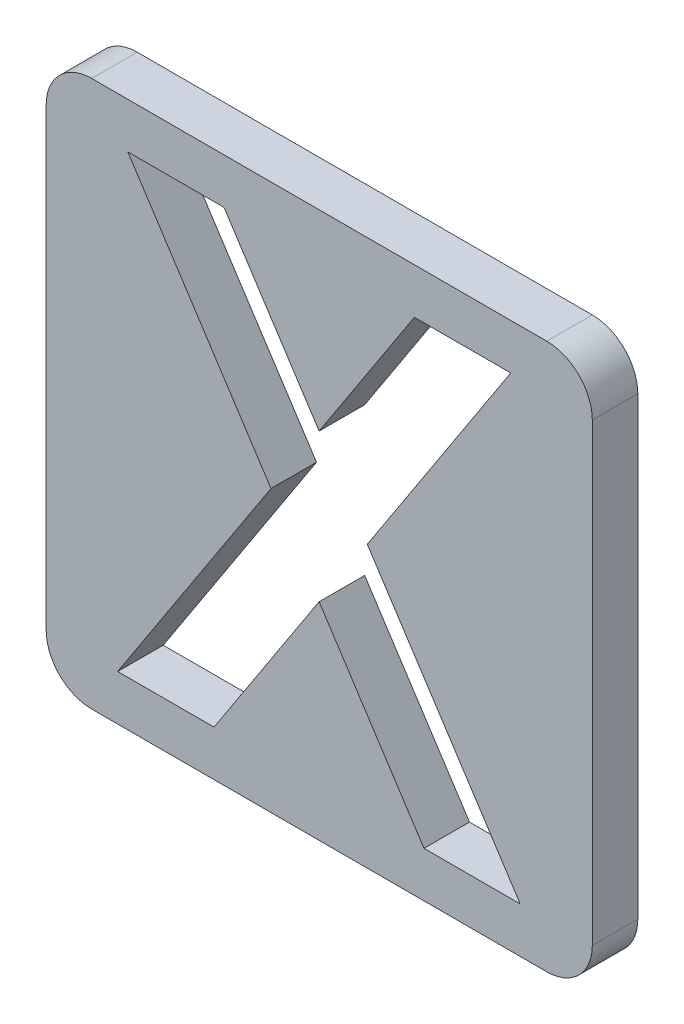
ISO-10303-21;
HEADER;
FILE_DESCRIPTION(('STEP AP214'),'2;1');
FILE_NAME('part.step','',(''),(''),'','','');
FILE_SCHEMA(('AUTOMOTIVE_DESIGN { 1 0 10303 214 1 1 1 1 }'));
ENDSEC;
DATA;
#1=APPLICATION_CONTEXT('core data for automotive mechanical design processes');
#2=APPLICATION_PROTOCOL_DEFINITION('international standard','automotive_design',2000,#1);
#3=PRODUCT_CONTEXT('',#1,'mechanical');
#4=PRODUCT('Part','Part','',(#3));
#5=PRODUCT_RELATED_PRODUCT_CATEGORY('part','',(#4));
#6=PRODUCT_DEFINITION_FORMATION('','',#4);
#7=PRODUCT_DEFINITION_CONTEXT('part definition',#1,'design');
#8=PRODUCT_DEFINITION('design','',#6,#7);
#9=PRODUCT_DEFINITION_SHAPE('','',#8);
#10=(LENGTH_UNIT() NAMED_UNIT(*) SI_UNIT(.MILLI.,.METRE.));
#11=(NAMED_UNIT(*) PLANE_ANGLE_UNIT() SI_UNIT($,.RADIAN.));
#12=(NAMED_UNIT(*) SI_UNIT($,.STERADIAN.) SOLID_ANGLE_UNIT());
#13=UNCERTAINTY_MEASURE_WITH_UNIT(LENGTH_MEASURE(1.E-05),#10,'distance_accuracy_value','');
#14=(GEOMETRIC_REPRESENTATION_CONTEXT(3) GLOBAL_UNCERTAINTY_ASSIGNED_CONTEXT((#13)) GLOBAL_UNIT_ASSIGNED_CONTEXT((#10,
#11,#12)) REPRESENTATION_CONTEXT('',''));
#15=CARTESIAN_POINT('',(0.,0.,0.));
#16=DIRECTION('',(0.,0.,1.));
#17=DIRECTION('',(1.,0.,0.));
#18=AXIS2_PLACEMENT_3D('',#15,#16,#17);
#19=CARTESIAN_POINT('',(50.,50.,10.));
#20=DIRECTION('',(0.,0.,-1.));
#21=DIRECTION('',(-1.,0.,0.));
#22=AXIS2_PLACEMENT_3D('',#19,#20,#21);
#23=PLANE('',#22);
#24=DIRECTION('',(1.,0.,0.));
#25=VECTOR('',#24,1.);
#26=CARTESIAN_POINT('',(-49.9999999999999,60.,10.));
#27=LINE('',#26,#25);
#28=CARTESIAN_POINT('',(-49.9999999999999,60.,10.));
#29=VERTEX_POINT('',#28);
#30=CARTESIAN_POINT('',(49.9999999999999,60.,10.));
#31=VERTEX_POINT('',#30);
#32=EDGE_CURVE('E265',#29,#31,#27,.T.);
#33=ORIENTED_EDGE('',*,*,#32,.F.);
#34=CARTESIAN_POINT('',(-50.,50.,10.));
#35=DIRECTION('',(0.,0.,1.));
#36=DIRECTION('',(1.,0.,0.));
#37=AXIS2_PLACEMENT_3D('',#34,#35,#36);
#38=CIRCLE('',#37,10.);
#39=CARTESIAN_POINT('',(-60.,49.9999999999999,10.));
#40=VERTEX_POINT('',#39);
#41=EDGE_CURVE('E283',#29,#40,#38,.T.);
#42=ORIENTED_EDGE('',*,*,#41,.T.);
#43=DIRECTION('',(0.,-1.,0.));
#44=VECTOR('',#43,1.);
#45=CARTESIAN_POINT('',(-60.,49.9999999999999,10.));
#46=LINE('',#45,#44);
#47=CARTESIAN_POINT('',(-60.,-49.9999999999999,10.));
#48=VERTEX_POINT('',#47);
#49=EDGE_CURVE('E281',#40,#48,#46,.T.);
#50=ORIENTED_EDGE('',*,*,#49,.T.);
#51=CARTESIAN_POINT('',(-50.,-50.,10.));
#52=DIRECTION('',(0.,0.,1.));
#53=DIRECTION('',(1.,0.,0.));
#54=AXIS2_PLACEMENT_3D('',#51,#52,#53);
#55=CIRCLE('',#54,10.);
#56=CARTESIAN_POINT('',(-49.9999999999999,-60.,10.));
#57=VERTEX_POINT('',#56);
#58=EDGE_CURVE('E279',#48,#57,#55,.T.);
#59=ORIENTED_EDGE('',*,*,#58,.T.);
#60=DIRECTION('',(1.,0.,0.));
#61=VECTOR('',#60,1.);
#62=CARTESIAN_POINT('',(-49.9999999999999,-60.,10.));
#63=LINE('',#62,#61);
#64=CARTESIAN_POINT('',(49.9999999999999,-60.,10.));
#65=VERTEX_POINT('',#64);
#66=EDGE_CURVE('E277',#57,#65,#63,.T.);
#67=ORIENTED_EDGE('',*,*,#66,.T.);
#68=CARTESIAN_POINT('',(50.,-50.,10.));
#69=DIRECTION('',(0.,0.,1.));
#70=DIRECTION('',(1.,0.,0.));
#71=AXIS2_PLACEMENT_3D('',#68,#69,#70);
#72=CIRCLE('',#71,10.);
#73=CARTESIAN_POINT('',(60.,-50.,10.));
#74=VERTEX_POINT('',#73);
#75=EDGE_CURVE('E275',#65,#74,#72,.T.);
#76=ORIENTED_EDGE('',*,*,#75,.T.);
#77=DIRECTION('',(0.,-1.,0.));
#78=VECTOR('',#77,1.);
#79=CARTESIAN_POINT('',(60.,49.9999999999999,10.));
#80=LINE('',#79,#78);
#81=CARTESIAN_POINT('',(60.,49.9999999999999,10.));
#82=VERTEX_POINT('',#81);
#83=EDGE_CURVE('E272',#82,#74,#80,.T.);
#84=ORIENTED_EDGE('',*,*,#83,.F.);
#85=CARTESIAN_POINT('',(50.,50.,10.));
#86=DIRECTION('',(0.,0.,-1.));
#87=DIRECTION('',(-1.,0.,0.));
#88=AXIS2_PLACEMENT_3D('',#85,#86,#87);
#89=CIRCLE('',#88,10.);
#90=EDGE_CURVE('E268',#31,#82,#89,.T.);
#91=ORIENTED_EDGE('',*,*,#90,.F.);
#92=EDGE_LOOP('',(#33,#42,#50,#59,#67,#76,#84,#91));
#93=FACE_BOUND('',#92,.T.);
#94=DIRECTION('',(-0.54561077963015,0.838038708623522,0.));
#95=VECTOR('',#94,1.);
#96=CARTESIAN_POINT('',(-10.6009615384615,1.66266025641025,10.));
#97=LINE('',#96,#95);
#98=CARTESIAN_POINT('',(-10.6009615384615,1.66266025641025,10.));
#99=VERTEX_POINT('',#98);
#100=CARTESIAN_POINT('',(-42.0713141025641,50.,10.));
#101=VERTEX_POINT('',#100);
#102=EDGE_CURVE('E50',#99,#101,#97,.T.);
#103=ORIENTED_EDGE('',*,*,#102,.T.);
#104=DIRECTION('',(1.,0.,0.));
#105=VECTOR('',#104,1.);
#106=CARTESIAN_POINT('',(-42.0713141025641,50.,10.));
#107=LINE('',#106,#105);
#108=CARTESIAN_POINT('',(-20.9174679487179,50.,10.));
#109=VERTEX_POINT('',#108);
#110=EDGE_CURVE('E186',#101,#109,#107,.T.);
#111=ORIENTED_EDGE('',*,*,#110,.T.);
#112=DIRECTION('',(0.545374257341928,-0.838192650545649,0.));
#113=VECTOR('',#112,1.);
#114=CARTESIAN_POINT('',(-20.9174679487179,50.,10.));
#115=LINE('',#114,#113);
#116=CARTESIAN_POINT('',(-0.0240384615384642,17.8886217948718,10.));
#117=VERTEX_POINT('',#116);
#118=EDGE_CURVE('E217',#109,#117,#115,.T.);
#119=ORIENTED_EDGE('',*,*,#118,.T.);
#120=DIRECTION('',(0.546108359383021,0.83771454554161,0.));
#121=VECTOR('',#120,1.);
#122=CARTESIAN_POINT('',(-0.0240384615384642,17.8886217948718,10.));
#123=LINE('',#122,#121);
#124=CARTESIAN_POINT('',(20.9094551282051,50.,10.));
#125=VERTEX_POINT('',#124);
#126=EDGE_CURVE('E220',#117,#125,#123,.T.);
#127=ORIENTED_EDGE('',*,*,#126,.T.);
#128=DIRECTION('',(1.,0.,0.));
#129=VECTOR('',#128,1.);
#130=CARTESIAN_POINT('',(20.9094551282051,50.,10.));
#131=LINE('',#130,#129);
#132=CARTESIAN_POINT('',(42.0833333333333,50.,10.));
#133=VERTEX_POINT('',#132);
#134=EDGE_CURVE('E223',#125,#133,#131,.T.);
#135=ORIENTED_EDGE('',*,*,#134,.T.);
#136=DIRECTION('',(-0.546183097919864,-0.837665818537835,0.));
#137=VECTOR('',#136,1.);
#138=CARTESIAN_POINT('',(42.0833333333333,50.,10.));
#139=LINE('',#138,#137);
#140=CARTESIAN_POINT('',(10.5528846153846,1.6426282051282,10.));
#141=VERTEX_POINT('',#140);
#142=EDGE_CURVE('E226',#133,#141,#139,.T.);
#143=ORIENTED_EDGE('',*,*,#142,.T.);
#144=DIRECTION('',(0.545513884714244,-0.838101784739762,0.));
#145=VECTOR('',#144,1.);
#146=CARTESIAN_POINT('',(10.5528846153846,1.6426282051282,10.));
#147=LINE('',#146,#145);
#148=CARTESIAN_POINT('',(44.1666666666667,-50.,10.));
#149=VERTEX_POINT('',#148);
#150=EDGE_CURVE('E229',#141,#149,#147,.T.);
#151=ORIENTED_EDGE('',*,*,#150,.T.);
#152=DIRECTION('',(-1.,0.,0.));
#153=VECTOR('',#152,1.);
#154=CARTESIAN_POINT('',(44.1666666666667,-50.,10.));
#155=LINE('',#154,#153);
#156=CARTESIAN_POINT('',(23.0128205128205,-50.,10.));
#157=VERTEX_POINT('',#156);
#158=EDGE_CURVE('E232',#149,#157,#155,.T.);
#159=ORIENTED_EDGE('',*,*,#158,.T.);
#160=DIRECTION('',(-0.545254971756398,0.838270252230705,0.));
#161=VECTOR('',#160,1.);
#162=CARTESIAN_POINT('',(23.0128205128205,-50.,10.));
#163=LINE('',#162,#161);
#164=CARTESIAN_POINT('',(-0.0240384615384642,-14.5833333333333,10.));
#165=VERTEX_POINT('',#164);
#166=EDGE_CURVE('E235',#157,#165,#163,.T.);
#167=ORIENTED_EDGE('',*,*,#166,.T.);
#168=DIRECTION('',(-0.54625332868769,-0.837620021786501,0.));
#169=VECTOR('',#168,1.);
#170=CARTESIAN_POINT('',(-0.0240384615384642,-14.5833333333333,10.));
#171=LINE('',#170,#169);
#172=CARTESIAN_POINT('',(-23.1209935897436,-50.,10.));
#173=VERTEX_POINT('',#172);
#174=EDGE_CURVE('E238',#165,#173,#171,.T.);
#175=ORIENTED_EDGE('',*,*,#174,.T.);
#176=DIRECTION('',(-1.,0.,0.));
#177=VECTOR('',#176,1.);
#178=CARTESIAN_POINT('',(-23.1209935897436,-50.,10.));
#179=LINE('',#178,#177);
#180=CARTESIAN_POINT('',(-44.2948717948718,-50.,10.));
#181=VERTEX_POINT('',#180);
#182=EDGE_CURVE('E241',#173,#181,#179,.T.);
#183=ORIENTED_EDGE('',*,*,#182,.T.);
#184=DIRECTION('',(0.546277687549728,0.837604135666319,0.));
#185=VECTOR('',#184,1.);
#186=CARTESIAN_POINT('',(-44.2948717948718,-50.,10.));
#187=LINE('',#186,#185);
#188=EDGE_CURVE('E180',#181,#99,#187,.T.);
#189=ORIENTED_EDGE('',*,*,#188,.T.);
#190=EDGE_LOOP('',(#103,#111,#119,#127,#135,#143,#151,#159,#167,#175,#183,#189));
#191=FACE_BOUND('',#190,.T.);
#192=ADVANCED_FACE('F33',(#93,#191),#23,.F.);
#193=CARTESIAN_POINT('',(50.,50.,0.));
#194=DIRECTION('',(0.,0.,-1.));
#195=DIRECTION('',(-1.,0.,0.));
#196=AXIS2_PLACEMENT_3D('',#193,#194,#195);
#197=PLANE('',#196);
#198=DIRECTION('',(1.,0.,0.));
#199=VECTOR('',#198,1.);
#200=CARTESIAN_POINT('',(-49.9999999999999,60.,0.));
#201=LINE('',#200,#199);
#202=CARTESIAN_POINT('',(-49.9999999999999,60.,0.));
#203=VERTEX_POINT('',#202);
#204=CARTESIAN_POINT('',(49.9999999999999,60.,0.));
#205=VERTEX_POINT('',#204);
#206=EDGE_CURVE('E187',#203,#205,#201,.T.);
#207=ORIENTED_EDGE('',*,*,#206,.T.);
#208=CARTESIAN_POINT('',(50.,50.,0.));
#209=DIRECTION('',(0.,0.,-1.));
#210=DIRECTION('',(-1.,0.,0.));
#211=AXIS2_PLACEMENT_3D('',#208,#209,#210);
#212=CIRCLE('',#211,10.);
#213=CARTESIAN_POINT('',(60.,49.9999999999999,0.));
#214=VERTEX_POINT('',#213);
#215=EDGE_CURVE('E287',#205,#214,#212,.T.);
#216=ORIENTED_EDGE('',*,*,#215,.T.);
#217=DIRECTION('',(0.,-1.,0.));
#218=VECTOR('',#217,1.);
#219=CARTESIAN_POINT('',(60.,49.9999999999999,0.));
#220=LINE('',#219,#218);
#221=CARTESIAN_POINT('',(60.,-50.,0.));
#222=VERTEX_POINT('',#221);
#223=EDGE_CURVE('E290',#214,#222,#220,.T.);
#224=ORIENTED_EDGE('',*,*,#223,.T.);
#225=CARTESIAN_POINT('',(50.,-50.,0.));
#226=DIRECTION('',(0.,0.,1.));
#227=DIRECTION('',(1.,0.,0.));
#228=AXIS2_PLACEMENT_3D('',#225,#226,#227);
#229=CIRCLE('',#228,10.);
#230=CARTESIAN_POINT('',(49.9999999999999,-60.,0.));
#231=VERTEX_POINT('',#230);
#232=EDGE_CURVE('E293',#231,#222,#229,.T.);
#233=ORIENTED_EDGE('',*,*,#232,.F.);
#234=DIRECTION('',(1.,0.,0.));
#235=VECTOR('',#234,1.);
#236=CARTESIAN_POINT('',(-49.9999999999999,-60.,0.));
#237=LINE('',#236,#235);
#238=CARTESIAN_POINT('',(-49.9999999999999,-60.,0.));
#239=VERTEX_POINT('',#238);
#240=EDGE_CURVE('E296',#239,#231,#237,.T.);
#241=ORIENTED_EDGE('',*,*,#240,.F.);
#242=CARTESIAN_POINT('',(-50.,-50.,0.));
#243=DIRECTION('',(0.,0.,1.));
#244=DIRECTION('',(1.,0.,0.));
#245=AXIS2_PLACEMENT_3D('',#242,#243,#244);
#246=CIRCLE('',#245,10.);
#247=CARTESIAN_POINT('',(-60.,-49.9999999999999,0.));
#248=VERTEX_POINT('',#247);
#249=EDGE_CURVE('E298',#248,#239,#246,.T.);
#250=ORIENTED_EDGE('',*,*,#249,.F.);
#251=DIRECTION('',(0.,-1.,0.));
#252=VECTOR('',#251,1.);
#253=CARTESIAN_POINT('',(-60.,49.9999999999999,0.));
#254=LINE('',#253,#252);
#255=CARTESIAN_POINT('',(-60.,49.9999999999999,0.));
#256=VERTEX_POINT('',#255);
#257=EDGE_CURVE('E300',#256,#248,#254,.T.);
#258=ORIENTED_EDGE('',*,*,#257,.F.);
#259=CARTESIAN_POINT('',(-50.,50.,0.));
#260=DIRECTION('',(0.,0.,1.));
#261=DIRECTION('',(1.,0.,0.));
#262=AXIS2_PLACEMENT_3D('',#259,#260,#261);
#263=CIRCLE('',#262,10.);
#264=EDGE_CURVE('E269',#203,#256,#263,.T.);
#265=ORIENTED_EDGE('',*,*,#264,.F.);
#266=EDGE_LOOP('',(#207,#216,#224,#233,#241,#250,#258,#265));
#267=FACE_BOUND('',#266,.T.);
#268=DIRECTION('',(1.,0.,0.));
#269=VECTOR('',#268,1.);
#270=CARTESIAN_POINT('',(-42.0713141025641,50.,0.));
#271=LINE('',#270,#269);
#272=CARTESIAN_POINT('',(-42.0713141025641,50.,0.));
#273=VERTEX_POINT('',#272);
#274=CARTESIAN_POINT('',(-20.9174679487179,50.,0.));
#275=VERTEX_POINT('',#274);
#276=EDGE_CURVE('E179',#273,#275,#271,.T.);
#277=ORIENTED_EDGE('',*,*,#276,.F.);
#278=DIRECTION('',(-0.54561077963015,0.838038708623522,0.));
#279=VECTOR('',#278,1.);
#280=CARTESIAN_POINT('',(-10.6009615384615,1.66266025641025,0.));
#281=LINE('',#280,#279);
#282=CARTESIAN_POINT('',(-10.6009615384615,1.66266025641025,0.));
#283=VERTEX_POINT('',#282);
#284=EDGE_CURVE('E171',#283,#273,#281,.T.);
#285=ORIENTED_EDGE('',*,*,#284,.F.);
#286=DIRECTION('',(0.546277687549728,0.837604135666319,0.));
#287=VECTOR('',#286,1.);
#288=CARTESIAN_POINT('',(-44.2948717948718,-50.,0.));
#289=LINE('',#288,#287);
#290=CARTESIAN_POINT('',(-44.2948717948718,-50.,0.));
#291=VERTEX_POINT('',#290);
#292=EDGE_CURVE('E213',#291,#283,#289,.T.);
#293=ORIENTED_EDGE('',*,*,#292,.F.);
#294=DIRECTION('',(-1.,0.,0.));
#295=VECTOR('',#294,1.);
#296=CARTESIAN_POINT('',(-23.1209935897436,-50.,0.));
#297=LINE('',#296,#295);
#298=CARTESIAN_POINT('',(-23.1209935897436,-50.,0.));
#299=VERTEX_POINT('',#298);
#300=EDGE_CURVE('E211',#299,#291,#297,.T.);
#301=ORIENTED_EDGE('',*,*,#300,.F.);
#302=DIRECTION('',(-0.54625332868769,-0.837620021786501,0.));
#303=VECTOR('',#302,1.);
#304=CARTESIAN_POINT('',(-0.0240384615384642,-14.5833333333333,0.));
#305=LINE('',#304,#303);
#306=CARTESIAN_POINT('',(-0.0240384615384642,-14.5833333333333,0.));
#307=VERTEX_POINT('',#306);
#308=EDGE_CURVE('E209',#307,#299,#305,.T.);
#309=ORIENTED_EDGE('',*,*,#308,.F.);
#310=DIRECTION('',(-0.545254971756398,0.838270252230705,0.));
#311=VECTOR('',#310,1.);
#312=CARTESIAN_POINT('',(23.0128205128205,-50.,0.));
#313=LINE('',#312,#311);
#314=CARTESIAN_POINT('',(23.0128205128205,-50.,0.));
#315=VERTEX_POINT('',#314);
#316=EDGE_CURVE('E207',#315,#307,#313,.T.);
#317=ORIENTED_EDGE('',*,*,#316,.F.);
#318=DIRECTION('',(-1.,0.,0.));
#319=VECTOR('',#318,1.);
#320=CARTESIAN_POINT('',(44.1666666666667,-50.,0.));
#321=LINE('',#320,#319);
#322=CARTESIAN_POINT('',(44.1666666666667,-50.,0.));
#323=VERTEX_POINT('',#322);
#324=EDGE_CURVE('E205',#323,#315,#321,.T.);
#325=ORIENTED_EDGE('',*,*,#324,.F.);
#326=DIRECTION('',(0.545513884714244,-0.838101784739762,0.));
#327=VECTOR('',#326,1.);
#328=CARTESIAN_POINT('',(10.5528846153846,1.6426282051282,0.));
#329=LINE('',#328,#327);
#330=CARTESIAN_POINT('',(10.5528846153846,1.6426282051282,0.));
#331=VERTEX_POINT('',#330);
#332=EDGE_CURVE('E203',#331,#323,#329,.T.);
#333=ORIENTED_EDGE('',*,*,#332,.F.);
#334=DIRECTION('',(-0.546183097919864,-0.837665818537835,0.));
#335=VECTOR('',#334,1.);
#336=CARTESIAN_POINT('',(42.0833333333333,50.,0.));
#337=LINE('',#336,#335);
#338=CARTESIAN_POINT('',(42.0833333333333,50.,0.));
#339=VERTEX_POINT('',#338);
#340=EDGE_CURVE('E201',#339,#331,#337,.T.);
#341=ORIENTED_EDGE('',*,*,#340,.F.);
#342=DIRECTION('',(1.,0.,0.));
#343=VECTOR('',#342,1.);
#344=CARTESIAN_POINT('',(20.9094551282051,50.,0.));
#345=LINE('',#344,#343);
#346=CARTESIAN_POINT('',(20.9094551282051,50.,0.));
#347=VERTEX_POINT('',#346);
#348=EDGE_CURVE('E199',#347,#339,#345,.T.);
#349=ORIENTED_EDGE('',*,*,#348,.F.);
#350=DIRECTION('',(0.546108359383021,0.83771454554161,0.));
#351=VECTOR('',#350,1.);
#352=CARTESIAN_POINT('',(-0.0240384615384642,17.8886217948718,0.));
#353=LINE('',#352,#351);
#354=CARTESIAN_POINT('',(-0.0240384615384642,17.8886217948718,0.));
#355=VERTEX_POINT('',#354);
#356=EDGE_CURVE('E195',#355,#347,#353,.T.);
#357=ORIENTED_EDGE('',*,*,#356,.F.);
#358=DIRECTION('',(0.545374257341928,-0.838192650545649,0.));
#359=VECTOR('',#358,1.);
#360=CARTESIAN_POINT('',(-20.9174679487179,50.,0.));
#361=LINE('',#360,#359);
#362=EDGE_CURVE('E193',#275,#355,#361,.T.);
#363=ORIENTED_EDGE('',*,*,#362,.F.);
#364=EDGE_LOOP('',(#277,#285,#293,#301,#309,#317,#325,#333,#341,#349,#357,#363));
#365=FACE_BOUND('',#364,.T.);
#366=ADVANCED_FACE('F191',(#267,#365),#197,.T.);
#367=CARTESIAN_POINT('',(-49.9999999999999,60.,10.));
#368=DIRECTION('',(0.,1.,0.));
#369=DIRECTION('',(0.,0.,1.));
#370=AXIS2_PLACEMENT_3D('',#367,#368,#369);
#371=PLANE('',#370);
#372=ORIENTED_EDGE('',*,*,#206,.F.);
#373=DIRECTION('',(0.,0.,-1.));
#374=VECTOR('',#373,1.);
#375=CARTESIAN_POINT('',(-49.9999999999999,60.,10.));
#376=LINE('',#375,#374);
#377=EDGE_CURVE('E11',#29,#203,#376,.T.);
#378=ORIENTED_EDGE('',*,*,#377,.F.);
#379=ORIENTED_EDGE('',*,*,#32,.T.);
#380=DIRECTION('',(0.,0.,-1.));
#381=VECTOR('',#380,1.);
#382=CARTESIAN_POINT('',(49.9999999999999,60.,10.));
#383=LINE('',#382,#381);
#384=EDGE_CURVE('E37',#31,#205,#383,.T.);
#385=ORIENTED_EDGE('',*,*,#384,.T.);
#386=EDGE_LOOP('',(#372,#378,#379,#385));
#387=FACE_BOUND('',#386,.T.);
#388=ADVANCED_FACE('F35',(#387),#371,.T.);
#389=CARTESIAN_POINT('',(-50.,50.,10.));
#390=DIRECTION('',(0.,0.,-1.));
#391=DIRECTION('',(-1.,0.,0.));
#392=AXIS2_PLACEMENT_3D('',#389,#390,#391);
#393=CYLINDRICAL_SURFACE('',#392,10.);
#394=ORIENTED_EDGE('',*,*,#264,.T.);
#395=DIRECTION('',(0.,0.,-1.));
#396=VECTOR('',#395,1.);
#397=CARTESIAN_POINT('',(-60.,49.9999999999999,10.));
#398=LINE('',#397,#396);
#399=EDGE_CURVE('E42',#40,#256,#398,.T.);
#400=ORIENTED_EDGE('',*,*,#399,.F.);
#401=ORIENTED_EDGE('',*,*,#41,.F.);
#402=ORIENTED_EDGE('',*,*,#377,.T.);
#403=EDGE_LOOP('',(#394,#400,#401,#402));
#404=FACE_BOUND('',#403,.T.);
#405=ADVANCED_FACE('F330',(#404),#393,.T.);
#406=CARTESIAN_POINT('',(-60.,49.9999999999999,10.));
#407=DIRECTION('',(1.,0.,0.));
#408=DIRECTION('',(0.,1.,0.));
#409=AXIS2_PLACEMENT_3D('',#406,#407,#408);
#410=PLANE('',#409);
#411=ORIENTED_EDGE('',*,*,#257,.T.);
#412=DIRECTION('',(0.,0.,-1.));
#413=VECTOR('',#412,1.);
#414=CARTESIAN_POINT('',(-60.,-49.9999999999999,10.));
#415=LINE('',#414,#413);
#416=EDGE_CURVE('E305',#48,#248,#415,.T.);
#417=ORIENTED_EDGE('',*,*,#416,.F.);
#418=ORIENTED_EDGE('',*,*,#49,.F.);
#419=ORIENTED_EDGE('',*,*,#399,.T.);
#420=EDGE_LOOP('',(#411,#417,#418,#419));
#421=FACE_BOUND('',#420,.T.);
#422=ADVANCED_FACE('F334',(#421),#410,.F.);
#423=CARTESIAN_POINT('',(-50.,-50.,10.));
#424=DIRECTION('',(0.,0.,-1.));
#425=DIRECTION('',(-1.,0.,0.));
#426=AXIS2_PLACEMENT_3D('',#423,#424,#425);
#427=CYLINDRICAL_SURFACE('',#426,10.);
#428=ORIENTED_EDGE('',*,*,#249,.T.);
#429=DIRECTION('',(0.,0.,-1.));
#430=VECTOR('',#429,1.);
#431=CARTESIAN_POINT('',(-49.9999999999999,-60.,10.));
#432=LINE('',#431,#430);
#433=EDGE_CURVE('E308',#57,#239,#432,.T.);
#434=ORIENTED_EDGE('',*,*,#433,.F.);
#435=ORIENTED_EDGE('',*,*,#58,.F.);
#436=ORIENTED_EDGE('',*,*,#416,.T.);
#437=EDGE_LOOP('',(#428,#434,#435,#436));
#438=FACE_BOUND('',#437,.T.);
#439=ADVANCED_FACE('F354',(#438),#427,.T.);
#440=CARTESIAN_POINT('',(-49.9999999999999,-60.,10.));
#441=DIRECTION('',(0.,1.,0.));
#442=DIRECTION('',(0.,0.,1.));
#443=AXIS2_PLACEMENT_3D('',#440,#441,#442);
#444=PLANE('',#443);
#445=ORIENTED_EDGE('',*,*,#240,.T.);
#446=DIRECTION('',(0.,0.,-1.));
#447=VECTOR('',#446,1.);
#448=CARTESIAN_POINT('',(49.9999999999999,-60.,10.));
#449=LINE('',#448,#447);
#450=EDGE_CURVE('E311',#65,#231,#449,.T.);
#451=ORIENTED_EDGE('',*,*,#450,.F.);
#452=ORIENTED_EDGE('',*,*,#66,.F.);
#453=ORIENTED_EDGE('',*,*,#433,.T.);
#454=EDGE_LOOP('',(#445,#451,#452,#453));
#455=FACE_BOUND('',#454,.T.);
#456=ADVANCED_FACE('F352',(#455),#444,.F.);
#457=CARTESIAN_POINT('',(50.,-50.,10.));
#458=DIRECTION('',(0.,0.,-1.));
#459=DIRECTION('',(-1.,0.,0.));
#460=AXIS2_PLACEMENT_3D('',#457,#458,#459);
#461=CYLINDRICAL_SURFACE('',#460,10.);
#462=ORIENTED_EDGE('',*,*,#232,.T.);
#463=DIRECTION('',(0.,0.,-1.));
#464=VECTOR('',#463,1.);
#465=CARTESIAN_POINT('',(60.,-50.,10.));
#466=LINE('',#465,#464);
#467=EDGE_CURVE('E314',#74,#222,#466,.T.);
#468=ORIENTED_EDGE('',*,*,#467,.F.);
#469=ORIENTED_EDGE('',*,*,#75,.F.);
#470=ORIENTED_EDGE('',*,*,#450,.T.);
#471=EDGE_LOOP('',(#462,#468,#469,#470));
#472=FACE_BOUND('',#471,.T.);
#473=ADVANCED_FACE('F348',(#472),#461,.T.);
#474=CARTESIAN_POINT('',(60.,49.9999999999999,10.));
#475=DIRECTION('',(1.,0.,0.));
#476=DIRECTION('',(0.,1.,0.));
#477=AXIS2_PLACEMENT_3D('',#474,#475,#476);
#478=PLANE('',#477);
#479=ORIENTED_EDGE('',*,*,#223,.F.);
#480=DIRECTION('',(0.,0.,-1.));
#481=VECTOR('',#480,1.);
#482=CARTESIAN_POINT('',(60.,49.9999999999999,10.));
#483=LINE('',#482,#481);
#484=EDGE_CURVE('E315',#82,#214,#483,.T.);
#485=ORIENTED_EDGE('',*,*,#484,.F.);
#486=ORIENTED_EDGE('',*,*,#83,.T.);
#487=ORIENTED_EDGE('',*,*,#467,.T.);
#488=EDGE_LOOP('',(#479,#485,#486,#487));
#489=FACE_BOUND('',#488,.T.);
#490=ADVANCED_FACE('F344',(#489),#478,.T.);
#491=CARTESIAN_POINT('',(50.,50.,10.));
#492=DIRECTION('',(0.,0.,-1.));
#493=DIRECTION('',(-1.,0.,0.));
#494=AXIS2_PLACEMENT_3D('',#491,#492,#493);
#495=CYLINDRICAL_SURFACE('',#494,10.);
#496=ORIENTED_EDGE('',*,*,#215,.F.);
#497=ORIENTED_EDGE('',*,*,#384,.F.);
#498=ORIENTED_EDGE('',*,*,#90,.T.);
#499=ORIENTED_EDGE('',*,*,#484,.T.);
#500=EDGE_LOOP('',(#496,#497,#498,#499));
#501=FACE_BOUND('',#500,.T.);
#502=ADVANCED_FACE('F323',(#501),#495,.T.);
#503=CARTESIAN_POINT('',(-10.6009615384615,1.66266025641025,0.));
#504=DIRECTION('',(0.838038708623522,0.54561077963015,0.));
#505=DIRECTION('',(-0.54561077963015,0.838038708623522,0.));
#506=AXIS2_PLACEMENT_3D('',#503,#504,#505);
#507=PLANE('',#506);
#508=ORIENTED_EDGE('',*,*,#102,.F.);
#509=DIRECTION('',(0.,0.,1.));
#510=VECTOR('',#509,1.);
#511=CARTESIAN_POINT('',(-10.6009615384615,1.66266025641025,0.));
#512=LINE('',#511,#510);
#513=EDGE_CURVE('E175',#283,#99,#512,.T.);
#514=ORIENTED_EDGE('',*,*,#513,.F.);
#515=ORIENTED_EDGE('',*,*,#284,.T.);
#516=DIRECTION('',(0.,0.,1.));
#517=VECTOR('',#516,1.);
#518=CARTESIAN_POINT('',(-42.0713141025641,50.,0.));
#519=LINE('',#518,#517);
#520=EDGE_CURVE('E174',#273,#101,#519,.T.);
#521=ORIENTED_EDGE('',*,*,#520,.T.);
#522=EDGE_LOOP('',(#508,#514,#515,#521));
#523=FACE_BOUND('',#522,.T.);
#524=ADVANCED_FACE('F173',(#523),#507,.T.);
#525=CARTESIAN_POINT('',(-42.0713141025641,50.,0.));
#526=DIRECTION('',(0.,-1.,0.));
#527=DIRECTION('',(0.,0.,-1.));
#528=AXIS2_PLACEMENT_3D('',#525,#526,#527);
#529=PLANE('',#528);
#530=ORIENTED_EDGE('',*,*,#110,.F.);
#531=ORIENTED_EDGE('',*,*,#520,.F.);
#532=ORIENTED_EDGE('',*,*,#276,.T.);
#533=DIRECTION('',(0.,0.,1.));
#534=VECTOR('',#533,1.);
#535=CARTESIAN_POINT('',(-20.9174679487179,50.,0.));
#536=LINE('',#535,#534);
#537=EDGE_CURVE('E188',#275,#109,#536,.T.);
#538=ORIENTED_EDGE('',*,*,#537,.T.);
#539=EDGE_LOOP('',(#530,#531,#532,#538));
#540=FACE_BOUND('',#539,.T.);
#541=ADVANCED_FACE('F183',(#540),#529,.T.);
#542=CARTESIAN_POINT('',(-20.9174679487179,50.,0.));
#543=DIRECTION('',(-0.838192650545649,-0.545374257341928,0.));
#544=DIRECTION('',(0.545374257341928,-0.838192650545649,0.));
#545=AXIS2_PLACEMENT_3D('',#542,#543,#544);
#546=PLANE('',#545);
#547=ORIENTED_EDGE('',*,*,#118,.F.);
#548=ORIENTED_EDGE('',*,*,#537,.F.);
#549=ORIENTED_EDGE('',*,*,#362,.T.);
#550=DIRECTION('',(0.,0.,1.));
#551=VECTOR('',#550,1.);
#552=CARTESIAN_POINT('',(-0.0240384615384642,17.8886217948718,0.));
#553=LINE('',#552,#551);
#554=EDGE_CURVE('E262',#355,#117,#553,.T.);
#555=ORIENTED_EDGE('',*,*,#554,.T.);
#556=EDGE_LOOP('',(#547,#548,#549,#555));
#557=FACE_BOUND('',#556,.T.);
#558=ADVANCED_FACE('F403',(#557),#546,.T.);
#559=CARTESIAN_POINT('',(-0.0240384615384642,17.8886217948718,0.));
#560=DIRECTION('',(0.83771454554161,-0.546108359383021,0.));
#561=DIRECTION('',(0.546108359383021,0.83771454554161,0.));
#562=AXIS2_PLACEMENT_3D('',#559,#560,#561);
#563=PLANE('',#562);
#564=ORIENTED_EDGE('',*,*,#126,.F.);
#565=ORIENTED_EDGE('',*,*,#554,.F.);
#566=ORIENTED_EDGE('',*,*,#356,.T.);
#567=DIRECTION('',(0.,0.,1.));
#568=VECTOR('',#567,1.);
#569=CARTESIAN_POINT('',(20.9094551282051,50.,0.));
#570=LINE('',#569,#568);
#571=EDGE_CURVE('E260',#347,#125,#570,.T.);
#572=ORIENTED_EDGE('',*,*,#571,.T.);
#573=EDGE_LOOP('',(#564,#565,#566,#572));
#574=FACE_BOUND('',#573,.T.);
#575=ADVANCED_FACE('F411',(#574),#563,.T.);
#576=CARTESIAN_POINT('',(20.9094551282051,50.,0.));
#577=DIRECTION('',(0.,-1.,0.));
#578=DIRECTION('',(0.,0.,-1.));
#579=AXIS2_PLACEMENT_3D('',#576,#577,#578);
#580=PLANE('',#579);
#581=ORIENTED_EDGE('',*,*,#134,.F.);
#582=ORIENTED_EDGE('',*,*,#571,.F.);
#583=ORIENTED_EDGE('',*,*,#348,.T.);
#584=DIRECTION('',(0.,0.,1.));
#585=VECTOR('',#584,1.);
#586=CARTESIAN_POINT('',(42.0833333333333,50.,0.));
#587=LINE('',#586,#585);
#588=EDGE_CURVE('E258',#339,#133,#587,.T.);
#589=ORIENTED_EDGE('',*,*,#588,.T.);
#590=EDGE_LOOP('',(#581,#582,#583,#589));
#591=FACE_BOUND('',#590,.T.);
#592=ADVANCED_FACE('F421',(#591),#580,.T.);
#593=CARTESIAN_POINT('',(42.0833333333333,50.,0.));
#594=DIRECTION('',(-0.837665818537835,0.546183097919864,0.));
#595=DIRECTION('',(-0.546183097919864,-0.837665818537835,0.));
#596=AXIS2_PLACEMENT_3D('',#593,#594,#595);
#597=PLANE('',#596);
#598=ORIENTED_EDGE('',*,*,#142,.F.);
#599=ORIENTED_EDGE('',*,*,#588,.F.);
#600=ORIENTED_EDGE('',*,*,#340,.T.);
#601=DIRECTION('',(0.,0.,1.));
#602=VECTOR('',#601,1.);
#603=CARTESIAN_POINT('',(10.5528846153846,1.6426282051282,0.));
#604=LINE('',#603,#602);
#605=EDGE_CURVE('E256',#331,#141,#604,.T.);
#606=ORIENTED_EDGE('',*,*,#605,.T.);
#607=EDGE_LOOP('',(#598,#599,#600,#606));
#608=FACE_BOUND('',#607,.T.);
#609=ADVANCED_FACE('F431',(#608),#597,.T.);
#610=CARTESIAN_POINT('',(10.5528846153846,1.6426282051282,0.));
#611=DIRECTION('',(-0.838101784739762,-0.545513884714244,0.));
#612=DIRECTION('',(0.545513884714244,-0.838101784739762,0.));
#613=AXIS2_PLACEMENT_3D('',#610,#611,#612);
#614=PLANE('',#613);
#615=ORIENTED_EDGE('',*,*,#150,.F.);
#616=ORIENTED_EDGE('',*,*,#605,.F.);
#617=ORIENTED_EDGE('',*,*,#332,.T.);
#618=DIRECTION('',(0.,0.,1.));
#619=VECTOR('',#618,1.);
#620=CARTESIAN_POINT('',(44.1666666666667,-50.,0.));
#621=LINE('',#620,#619);
#622=EDGE_CURVE('E254',#323,#149,#621,.T.);
#623=ORIENTED_EDGE('',*,*,#622,.T.);
#624=EDGE_LOOP('',(#615,#616,#617,#623));
#625=FACE_BOUND('',#624,.T.);
#626=ADVANCED_FACE('F441',(#625),#614,.T.);
#627=CARTESIAN_POINT('',(44.1666666666667,-50.,0.));
#628=DIRECTION('',(0.,1.,0.));
#629=DIRECTION('',(0.,0.,1.));
#630=AXIS2_PLACEMENT_3D('',#627,#628,#629);
#631=PLANE('',#630);
#632=ORIENTED_EDGE('',*,*,#158,.F.);
#633=ORIENTED_EDGE('',*,*,#622,.F.);
#634=ORIENTED_EDGE('',*,*,#324,.T.);
#635=DIRECTION('',(0.,0.,1.));
#636=VECTOR('',#635,1.);
#637=CARTESIAN_POINT('',(23.0128205128205,-50.,0.));
#638=LINE('',#637,#636);
#639=EDGE_CURVE('E252',#315,#157,#638,.T.);
#640=ORIENTED_EDGE('',*,*,#639,.T.);
#641=EDGE_LOOP('',(#632,#633,#634,#640));
#642=FACE_BOUND('',#641,.T.);
#643=ADVANCED_FACE('F451',(#642),#631,.T.);
#644=CARTESIAN_POINT('',(23.0128205128205,-50.,0.));
#645=DIRECTION('',(0.838270252230705,0.545254971756398,0.));
#646=DIRECTION('',(-0.545254971756398,0.838270252230705,0.));
#647=AXIS2_PLACEMENT_3D('',#644,#645,#646);
#648=PLANE('',#647);
#649=ORIENTED_EDGE('',*,*,#166,.F.);
#650=ORIENTED_EDGE('',*,*,#639,.F.);
#651=ORIENTED_EDGE('',*,*,#316,.T.);
#652=DIRECTION('',(0.,0.,1.));
#653=VECTOR('',#652,1.);
#654=CARTESIAN_POINT('',(-0.0240384615384642,-14.5833333333333,0.));
#655=LINE('',#654,#653);
#656=EDGE_CURVE('E250',#307,#165,#655,.T.);
#657=ORIENTED_EDGE('',*,*,#656,.T.);
#658=EDGE_LOOP('',(#649,#650,#651,#657));
#659=FACE_BOUND('',#658,.T.);
#660=ADVANCED_FACE('F461',(#659),#648,.T.);
#661=CARTESIAN_POINT('',(-0.0240384615384642,-14.5833333333333,0.));
#662=DIRECTION('',(-0.837620021786501,0.54625332868769,0.));
#663=DIRECTION('',(-0.54625332868769,-0.837620021786501,0.));
#664=AXIS2_PLACEMENT_3D('',#661,#662,#663);
#665=PLANE('',#664);
#666=ORIENTED_EDGE('',*,*,#174,.F.);
#667=ORIENTED_EDGE('',*,*,#656,.F.);
#668=ORIENTED_EDGE('',*,*,#308,.T.);
#669=DIRECTION('',(0.,0.,1.));
#670=VECTOR('',#669,1.);
#671=CARTESIAN_POINT('',(-23.1209935897436,-50.,0.));
#672=LINE('',#671,#670);
#673=EDGE_CURVE('E248',#299,#173,#672,.T.);
#674=ORIENTED_EDGE('',*,*,#673,.T.);
#675=EDGE_LOOP('',(#666,#667,#668,#674));
#676=FACE_BOUND('',#675,.T.);
#677=ADVANCED_FACE('F471',(#676),#665,.T.);
#678=CARTESIAN_POINT('',(-23.1209935897436,-50.,0.));
#679=DIRECTION('',(0.,1.,0.));
#680=DIRECTION('',(0.,0.,1.));
#681=AXIS2_PLACEMENT_3D('',#678,#679,#680);
#682=PLANE('',#681);
#683=ORIENTED_EDGE('',*,*,#182,.F.);
#684=ORIENTED_EDGE('',*,*,#673,.F.);
#685=ORIENTED_EDGE('',*,*,#300,.T.);
#686=DIRECTION('',(0.,0.,1.));
#687=VECTOR('',#686,1.);
#688=CARTESIAN_POINT('',(-44.2948717948718,-50.,0.));
#689=LINE('',#688,#687);
#690=EDGE_CURVE('E58',#291,#181,#689,.T.);
#691=ORIENTED_EDGE('',*,*,#690,.T.);
#692=EDGE_LOOP('',(#683,#684,#685,#691));
#693=FACE_BOUND('',#692,.T.);
#694=ADVANCED_FACE('F481',(#693),#682,.T.);
#695=CARTESIAN_POINT('',(-44.2948717948718,-50.,0.));
#696=DIRECTION('',(0.837604135666319,-0.546277687549728,0.));
#697=DIRECTION('',(0.546277687549728,0.837604135666319,0.));
#698=AXIS2_PLACEMENT_3D('',#695,#696,#697);
#699=PLANE('',#698);
#700=ORIENTED_EDGE('',*,*,#188,.F.);
#701=ORIENTED_EDGE('',*,*,#690,.F.);
#702=ORIENTED_EDGE('',*,*,#292,.T.);
#703=ORIENTED_EDGE('',*,*,#513,.T.);
#704=EDGE_LOOP('',(#700,#701,#702,#703));
#705=FACE_BOUND('',#704,.T.);
#706=ADVANCED_FACE('F491',(#705),#699,.T.);
#707=CLOSED_SHELL('',(#192,#366,#388,#405,#422,#439,#456,#473,#490,#502,#524,#541,#558,#575,
#592,#609,#626,#643,#660,#677,#694,#706));
#708=MANIFOLD_SOLID_BREP('B2',#707);
#709=ADVANCED_BREP_SHAPE_REPRESENTATION('',(#18,#708),#14);
#710=SHAPE_DEFINITION_REPRESENTATION(#9,#709);
ENDSEC;
END-ISO-10303-21;
